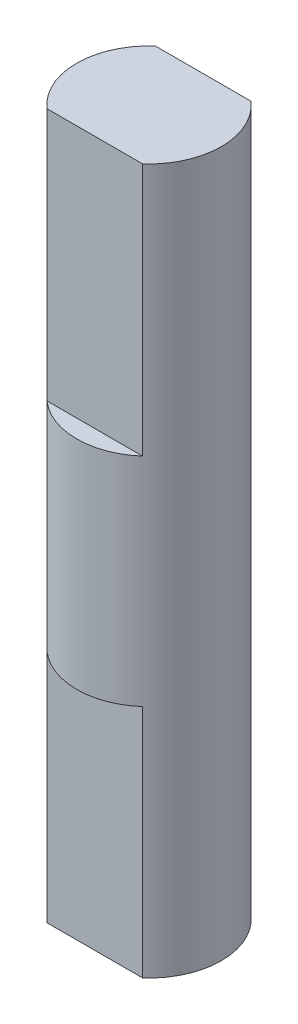
ISO-10303-21;
HEADER;
FILE_DESCRIPTION(('STEP AP214'),'2;1');
FILE_NAME('part.step','',(''),(''),'','','');
FILE_SCHEMA(('AUTOMOTIVE_DESIGN { 1 0 10303 214 1 1 1 1 }'));
ENDSEC;
DATA;
#1=APPLICATION_CONTEXT('core data for automotive mechanical design processes');
#2=APPLICATION_PROTOCOL_DEFINITION('international standard','automotive_design',2000,#1);
#3=PRODUCT_CONTEXT('',#1,'mechanical');
#4=PRODUCT('Part','Part','',(#3));
#5=PRODUCT_RELATED_PRODUCT_CATEGORY('part','',(#4));
#6=PRODUCT_DEFINITION_FORMATION('','',#4);
#7=PRODUCT_DEFINITION_CONTEXT('part definition',#1,'design');
#8=PRODUCT_DEFINITION('design','',#6,#7);
#9=PRODUCT_DEFINITION_SHAPE('','',#8);
#10=(LENGTH_UNIT() NAMED_UNIT(*) SI_UNIT(.MILLI.,.METRE.));
#11=(NAMED_UNIT(*) PLANE_ANGLE_UNIT() SI_UNIT($,.RADIAN.));
#12=(NAMED_UNIT(*) SI_UNIT($,.STERADIAN.) SOLID_ANGLE_UNIT());
#13=UNCERTAINTY_MEASURE_WITH_UNIT(LENGTH_MEASURE(1.E-05),#10,'distance_accuracy_value','');
#14=(GEOMETRIC_REPRESENTATION_CONTEXT(3) GLOBAL_UNCERTAINTY_ASSIGNED_CONTEXT((#13)) GLOBAL_UNIT_ASSIGNED_CONTEXT((#10,
#11,#12)) REPRESENTATION_CONTEXT('',''));
#15=CARTESIAN_POINT('',(0.,0.,0.));
#16=DIRECTION('',(0.,0.,1.));
#17=DIRECTION('',(1.,0.,0.));
#18=AXIS2_PLACEMENT_3D('',#15,#16,#17);
#19=CARTESIAN_POINT('',(0.,12.,0.));
#20=DIRECTION('',(0.,1.,0.));
#21=DIRECTION('',(0.,0.,1.));
#22=AXIS2_PLACEMENT_3D('',#19,#20,#21);
#23=PLANE('',#22);
#24=DIRECTION('',(1.,0.,0.));
#25=VECTOR('',#24,1.);
#26=CARTESIAN_POINT('',(0.,12.,3.));
#27=LINE('',#26,#25);
#28=CARTESIAN_POINT('',(-2.64575131106459,12.,3.));
#29=VERTEX_POINT('',#28);
#30=CARTESIAN_POINT('',(2.64575131106459,12.,3.));
#31=VERTEX_POINT('',#30);
#32=EDGE_CURVE('E58',#29,#31,#27,.T.);
#33=ORIENTED_EDGE('',*,*,#32,.F.);
#34=CARTESIAN_POINT('',(0.,12.,0.));
#35=DIRECTION('',(0.,1.,0.));
#36=DIRECTION('',(0.,0.,1.));
#37=AXIS2_PLACEMENT_3D('',#34,#35,#36);
#38=CIRCLE('',#37,4.);
#39=EDGE_CURVE('E176',#29,#31,#38,.T.);
#40=ORIENTED_EDGE('',*,*,#39,.T.);
#41=EDGE_LOOP('',(#33,#40));
#42=FACE_BOUND('',#41,.T.);
#43=ADVANCED_FACE('F43',(#42),#23,.T.);
#44=CARTESIAN_POINT('',(0.,0.,0.));
#45=DIRECTION('',(0.,1.,0.));
#46=DIRECTION('',(0.,0.,1.));
#47=AXIS2_PLACEMENT_3D('',#44,#45,#46);
#48=PLANE('',#47);
#49=CARTESIAN_POINT('',(0.,0.,0.));
#50=DIRECTION('',(0.,1.,0.));
#51=DIRECTION('',(0.,0.,1.));
#52=AXIS2_PLACEMENT_3D('',#49,#50,#51);
#53=CIRCLE('',#52,4.);
#54=CARTESIAN_POINT('',(-2.64575131106459,0.,3.));
#55=VERTEX_POINT('',#54);
#56=CARTESIAN_POINT('',(2.64575131106459,0.,3.));
#57=VERTEX_POINT('',#56);
#58=EDGE_CURVE('E175',#55,#57,#53,.T.);
#59=ORIENTED_EDGE('',*,*,#58,.F.);
#60=DIRECTION('',(1.,0.,0.));
#61=VECTOR('',#60,1.);
#62=CARTESIAN_POINT('',(0.,0.,3.));
#63=LINE('',#62,#61);
#64=EDGE_CURVE('E11',#55,#57,#63,.T.);
#65=ORIENTED_EDGE('',*,*,#64,.T.);
#66=EDGE_LOOP('',(#59,#65));
#67=FACE_BOUND('',#66,.T.);
#68=ADVANCED_FACE('F198',(#67),#48,.F.);
#69=CARTESIAN_POINT('',(0.,12.,0.));
#70=DIRECTION('',(0.,-1.,0.));
#71=DIRECTION('',(0.,0.,-1.));
#72=AXIS2_PLACEMENT_3D('',#69,#70,#71);
#73=CYLINDRICAL_SURFACE('',#72,4.);
#74=DIRECTION('',(0.,1.,0.));
#75=VECTOR('',#74,1.);
#76=CARTESIAN_POINT('',(-2.64575131106459,-13.,3.));
#77=LINE('',#76,#75);
#78=CARTESIAN_POINT('',(-2.64575131106459,-13.,3.));
#79=VERTEX_POINT('',#78);
#80=EDGE_CURVE('E161',#79,#55,#77,.T.);
#81=ORIENTED_EDGE('',*,*,#80,.T.);
#82=ORIENTED_EDGE('',*,*,#58,.T.);
#83=DIRECTION('',(0.,1.,0.));
#84=VECTOR('',#83,1.);
#85=CARTESIAN_POINT('',(2.64575131106459,-13.,3.));
#86=LINE('',#85,#84);
#87=CARTESIAN_POINT('',(2.64575131106459,-13.,3.));
#88=VERTEX_POINT('',#87);
#89=EDGE_CURVE('E157',#88,#57,#86,.T.);
#90=ORIENTED_EDGE('',*,*,#89,.F.);
#91=CARTESIAN_POINT('',(0.,-13.,0.));
#92=DIRECTION('',(0.,1.,0.));
#93=DIRECTION('',(0.,0.,1.));
#94=AXIS2_PLACEMENT_3D('',#91,#92,#93);
#95=CIRCLE('',#94,4.);
#96=CARTESIAN_POINT('',(2.64575131106459,-13.,-3.));
#97=VERTEX_POINT('',#96);
#98=EDGE_CURVE('E142',#88,#97,#95,.T.);
#99=ORIENTED_EDGE('',*,*,#98,.T.);
#100=DIRECTION('',(0.,1.,0.));
#101=VECTOR('',#100,1.);
#102=CARTESIAN_POINT('',(2.64575131106459,-13.,-3.));
#103=LINE('',#102,#101);
#104=CARTESIAN_POINT('',(2.64575131106459,0.,-3.));
#105=VERTEX_POINT('',#104);
#106=EDGE_CURVE('E118',#97,#105,#103,.T.);
#107=ORIENTED_EDGE('',*,*,#106,.T.);
#108=CARTESIAN_POINT('',(-2.64575131106459,0.,-3.));
#109=VERTEX_POINT('',#108);
#110=EDGE_CURVE('E179',#105,#109,#53,.T.);
#111=ORIENTED_EDGE('',*,*,#110,.T.);
#112=DIRECTION('',(0.,1.,0.));
#113=VECTOR('',#112,1.);
#114=CARTESIAN_POINT('',(-2.64575131106459,-13.,-3.));
#115=LINE('',#114,#113);
#116=CARTESIAN_POINT('',(-2.64575131106459,-13.,-3.));
#117=VERTEX_POINT('',#116);
#118=EDGE_CURVE('E166',#117,#109,#115,.T.);
#119=ORIENTED_EDGE('',*,*,#118,.F.);
#120=CARTESIAN_POINT('',(0.,-13.,0.));
#121=DIRECTION('',(0.,1.,0.));
#122=DIRECTION('',(0.,0.,1.));
#123=AXIS2_PLACEMENT_3D('',#120,#121,#122);
#124=CIRCLE('',#123,4.);
#125=EDGE_CURVE('E150',#117,#79,#124,.T.);
#126=ORIENTED_EDGE('',*,*,#125,.T.);
#127=EDGE_LOOP('',(#81,#82,#90,#99,#107,#111,#119,#126));
#128=FACE_BOUND('',#127,.T.);
#129=CARTESIAN_POINT('',(2.64575131106459,12.,-3.));
#130=VERTEX_POINT('',#129);
#131=CARTESIAN_POINT('',(-2.64575131106459,12.,-3.));
#132=VERTEX_POINT('',#131);
#133=EDGE_CURVE('E115',#130,#132,#38,.T.);
#134=ORIENTED_EDGE('',*,*,#133,.F.);
#135=CARTESIAN_POINT('',(2.64575131106459,26.,-3.));
#136=VERTEX_POINT('',#135);
#137=EDGE_CURVE('E109',#130,#136,#103,.T.);
#138=ORIENTED_EDGE('',*,*,#137,.T.);
#139=CARTESIAN_POINT('',(0.,26.,0.));
#140=DIRECTION('',(0.,1.,0.));
#141=DIRECTION('',(0.,0.,1.));
#142=AXIS2_PLACEMENT_3D('',#139,#140,#141);
#143=CIRCLE('',#142,4.);
#144=CARTESIAN_POINT('',(2.64575131106459,26.,3.));
#145=VERTEX_POINT('',#144);
#146=EDGE_CURVE('E113',#145,#136,#143,.T.);
#147=ORIENTED_EDGE('',*,*,#146,.F.);
#148=EDGE_CURVE('E160',#31,#145,#86,.T.);
#149=ORIENTED_EDGE('',*,*,#148,.F.);
#150=ORIENTED_EDGE('',*,*,#39,.F.);
#151=CARTESIAN_POINT('',(-2.64575131106459,26.,3.));
#152=VERTEX_POINT('',#151);
#153=EDGE_CURVE('E165',#29,#152,#77,.T.);
#154=ORIENTED_EDGE('',*,*,#153,.T.);
#155=CARTESIAN_POINT('',(0.,26.,0.));
#156=DIRECTION('',(0.,1.,0.));
#157=DIRECTION('',(0.,0.,1.));
#158=AXIS2_PLACEMENT_3D('',#155,#156,#157);
#159=CIRCLE('',#158,4.);
#160=CARTESIAN_POINT('',(-2.64575131106459,26.,-3.));
#161=VERTEX_POINT('',#160);
#162=EDGE_CURVE('E129',#161,#152,#159,.T.);
#163=ORIENTED_EDGE('',*,*,#162,.F.);
#164=EDGE_CURVE('E124',#132,#161,#115,.T.);
#165=ORIENTED_EDGE('',*,*,#164,.F.);
#166=EDGE_LOOP('',(#134,#138,#147,#149,#150,#154,#163,#165));
#167=FACE_BOUND('',#166,.T.);
#168=ADVANCED_FACE('F45',(#128,#167),#73,.T.);
#169=DIRECTION('',(-1.,0.,0.));
#170=VECTOR('',#169,1.);
#171=CARTESIAN_POINT('',(0.,12.,-3.));
#172=LINE('',#171,#170);
#173=EDGE_CURVE('E65',#130,#132,#172,.T.);
#174=ORIENTED_EDGE('',*,*,#173,.F.);
#175=ORIENTED_EDGE('',*,*,#133,.T.);
#176=EDGE_LOOP('',(#174,#175));
#177=FACE_BOUND('',#176,.T.);
#178=ADVANCED_FACE('F188',(#177),#23,.T.);
#179=ORIENTED_EDGE('',*,*,#110,.F.);
#180=DIRECTION('',(-1.,0.,0.));
#181=VECTOR('',#180,1.);
#182=CARTESIAN_POINT('',(0.,0.,-3.));
#183=LINE('',#182,#181);
#184=EDGE_CURVE('E52',#105,#109,#183,.T.);
#185=ORIENTED_EDGE('',*,*,#184,.T.);
#186=EDGE_LOOP('',(#179,#185));
#187=FACE_BOUND('',#186,.T.);
#188=ADVANCED_FACE('F195',(#187),#48,.F.);
#189=CARTESIAN_POINT('',(0.,-13.,0.));
#190=DIRECTION('',(0.,1.,0.));
#191=DIRECTION('',(0.,0.,1.));
#192=AXIS2_PLACEMENT_3D('',#189,#190,#191);
#193=PLANE('',#192);
#194=ORIENTED_EDGE('',*,*,#98,.F.);
#195=DIRECTION('',(1.,0.,0.));
#196=VECTOR('',#195,1.);
#197=CARTESIAN_POINT('',(-2.64575131106459,-13.,3.));
#198=LINE('',#197,#196);
#199=EDGE_CURVE('E119',#79,#88,#198,.T.);
#200=ORIENTED_EDGE('',*,*,#199,.F.);
#201=ORIENTED_EDGE('',*,*,#125,.F.);
#202=DIRECTION('',(-1.,0.,0.));
#203=VECTOR('',#202,1.);
#204=CARTESIAN_POINT('',(-2.64575131106459,-13.,-3.));
#205=LINE('',#204,#203);
#206=EDGE_CURVE('E146',#97,#117,#205,.T.);
#207=ORIENTED_EDGE('',*,*,#206,.F.);
#208=EDGE_LOOP('',(#194,#200,#201,#207));
#209=FACE_BOUND('',#208,.T.);
#210=ADVANCED_FACE('F197',(#209),#193,.F.);
#211=CARTESIAN_POINT('',(-2.64575131106459,-13.,-3.));
#212=DIRECTION('',(0.,0.,-1.));
#213=DIRECTION('',(-1.,0.,0.));
#214=AXIS2_PLACEMENT_3D('',#211,#212,#213);
#215=PLANE('',#214);
#216=ORIENTED_EDGE('',*,*,#184,.F.);
#217=ORIENTED_EDGE('',*,*,#106,.F.);
#218=ORIENTED_EDGE('',*,*,#206,.T.);
#219=ORIENTED_EDGE('',*,*,#118,.T.);
#220=EDGE_LOOP('',(#216,#217,#218,#219));
#221=FACE_BOUND('',#220,.T.);
#222=ADVANCED_FACE('F203',(#221),#215,.T.);
#223=CARTESIAN_POINT('',(-2.64575131106459,-13.,3.));
#224=DIRECTION('',(0.,0.,1.));
#225=DIRECTION('',(1.,0.,0.));
#226=AXIS2_PLACEMENT_3D('',#223,#224,#225);
#227=PLANE('',#226);
#228=ORIENTED_EDGE('',*,*,#64,.F.);
#229=ORIENTED_EDGE('',*,*,#80,.F.);
#230=ORIENTED_EDGE('',*,*,#199,.T.);
#231=ORIENTED_EDGE('',*,*,#89,.T.);
#232=EDGE_LOOP('',(#228,#229,#230,#231));
#233=FACE_BOUND('',#232,.T.);
#234=ADVANCED_FACE('F217',(#233),#227,.T.);
#235=ORIENTED_EDGE('',*,*,#153,.F.);
#236=ORIENTED_EDGE('',*,*,#32,.T.);
#237=ORIENTED_EDGE('',*,*,#148,.T.);
#238=DIRECTION('',(1.,0.,0.));
#239=VECTOR('',#238,1.);
#240=CARTESIAN_POINT('',(-2.64575131106459,26.,3.));
#241=LINE('',#240,#239);
#242=EDGE_CURVE('E134',#152,#145,#241,.T.);
#243=ORIENTED_EDGE('',*,*,#242,.F.);
#244=EDGE_LOOP('',(#235,#236,#237,#243));
#245=FACE_BOUND('',#244,.T.);
#246=ADVANCED_FACE('F215',(#245),#227,.T.);
#247=ORIENTED_EDGE('',*,*,#137,.F.);
#248=ORIENTED_EDGE('',*,*,#173,.T.);
#249=ORIENTED_EDGE('',*,*,#164,.T.);
#250=DIRECTION('',(-1.,0.,0.));
#251=VECTOR('',#250,1.);
#252=CARTESIAN_POINT('',(-2.64575131106459,26.,-3.));
#253=LINE('',#252,#251);
#254=EDGE_CURVE('E122',#136,#161,#253,.T.);
#255=ORIENTED_EDGE('',*,*,#254,.F.);
#256=EDGE_LOOP('',(#247,#248,#249,#255));
#257=FACE_BOUND('',#256,.T.);
#258=ADVANCED_FACE('F123',(#257),#215,.T.);
#259=CARTESIAN_POINT('',(0.,26.,0.));
#260=DIRECTION('',(0.,1.,0.));
#261=DIRECTION('',(0.,0.,1.));
#262=AXIS2_PLACEMENT_3D('',#259,#260,#261);
#263=PLANE('',#262);
#264=ORIENTED_EDGE('',*,*,#146,.T.);
#265=ORIENTED_EDGE('',*,*,#254,.T.);
#266=ORIENTED_EDGE('',*,*,#162,.T.);
#267=ORIENTED_EDGE('',*,*,#242,.T.);
#268=EDGE_LOOP('',(#264,#265,#266,#267));
#269=FACE_BOUND('',#268,.T.);
#270=ADVANCED_FACE('F132',(#269),#263,.T.);
#271=CLOSED_SHELL('',(#43,#68,#168,#178,#188,#210,#222,#234,#246,#258,#270));
#272=MANIFOLD_SOLID_BREP('B2',#271);
#273=ADVANCED_BREP_SHAPE_REPRESENTATION('',(#18,#272),#14);
#274=SHAPE_DEFINITION_REPRESENTATION(#9,#273);
ENDSEC;
END-ISO-10303-21;
